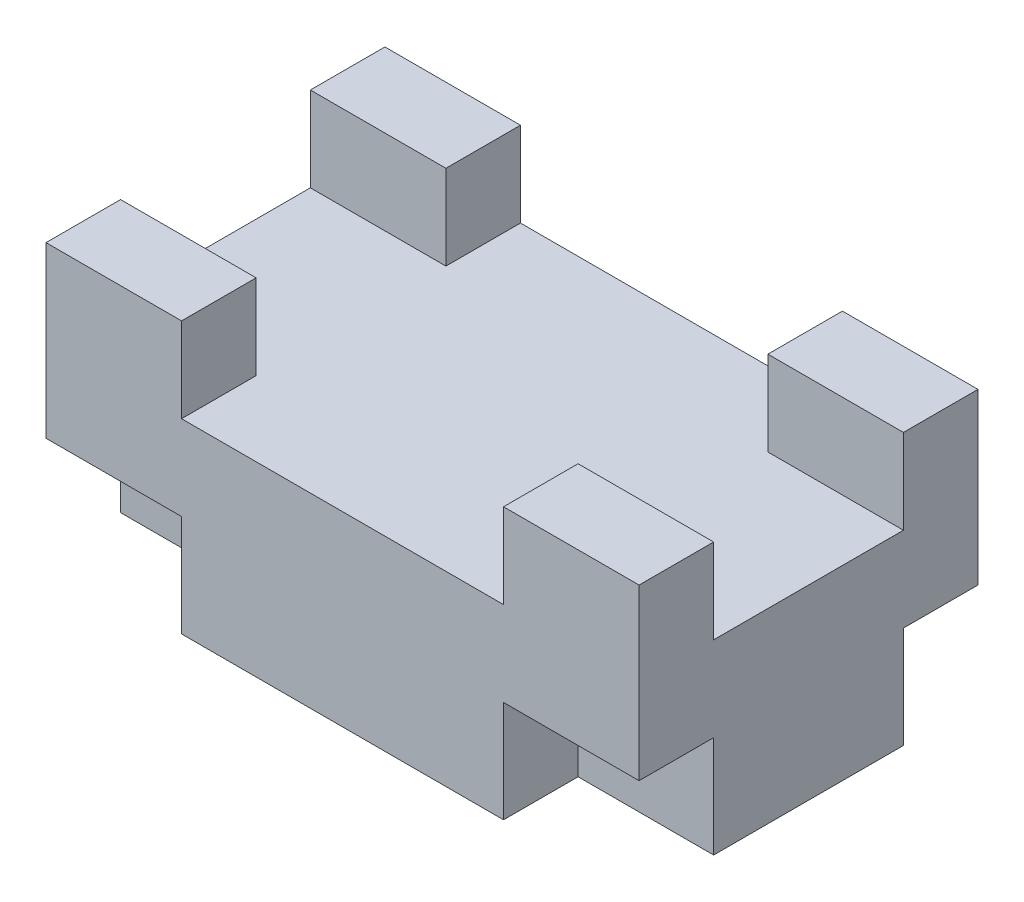
ISO-10303-21;
HEADER;
FILE_DESCRIPTION(('STEP AP214'),'2;1');
FILE_NAME('part.step','',(''),(''),'','','');
FILE_SCHEMA(('AUTOMOTIVE_DESIGN { 1 0 10303 214 1 1 1 1 }'));
ENDSEC;
DATA;
#1=APPLICATION_CONTEXT('core data for automotive mechanical design processes');
#2=APPLICATION_PROTOCOL_DEFINITION('international standard','automotive_design',2000,#1);
#3=PRODUCT_CONTEXT('',#1,'mechanical');
#4=PRODUCT('Part','Part','',(#3));
#5=PRODUCT_RELATED_PRODUCT_CATEGORY('part','',(#4));
#6=PRODUCT_DEFINITION_FORMATION('','',#4);
#7=PRODUCT_DEFINITION_CONTEXT('part definition',#1,'design');
#8=PRODUCT_DEFINITION('design','',#6,#7);
#9=PRODUCT_DEFINITION_SHAPE('','',#8);
#10=(LENGTH_UNIT() NAMED_UNIT(*) SI_UNIT(.MILLI.,.METRE.));
#11=(NAMED_UNIT(*) PLANE_ANGLE_UNIT() SI_UNIT($,.RADIAN.));
#12=(NAMED_UNIT(*) SI_UNIT($,.STERADIAN.) SOLID_ANGLE_UNIT());
#13=UNCERTAINTY_MEASURE_WITH_UNIT(LENGTH_MEASURE(1.E-05),#10,'distance_accuracy_value','');
#14=(GEOMETRIC_REPRESENTATION_CONTEXT(3) GLOBAL_UNCERTAINTY_ASSIGNED_CONTEXT((#13)) GLOBAL_UNIT_ASSIGNED_CONTEXT((#10,
#11,#12)) REPRESENTATION_CONTEXT('',''));
#15=CARTESIAN_POINT('',(0.,0.,0.));
#16=DIRECTION('',(0.,0.,1.));
#17=DIRECTION('',(1.,0.,0.));
#18=AXIS2_PLACEMENT_3D('',#15,#16,#17);
#19=CARTESIAN_POINT('',(0.,30.,0.));
#20=DIRECTION('',(0.,0.,1.));
#21=DIRECTION('',(1.,0.,0.));
#22=AXIS2_PLACEMENT_3D('',#19,#20,#21);
#23=PLANE('',#22);
#24=DIRECTION('',(1.,0.,0.));
#25=VECTOR('',#24,1.);
#26=CARTESIAN_POINT('',(0.,30.,0.));
#27=LINE('',#26,#25);
#28=CARTESIAN_POINT('',(-175.,30.,0.));
#29=VERTEX_POINT('',#28);
#30=CARTESIAN_POINT('',(-135.,30.,0.));
#31=VERTEX_POINT('',#30);
#32=EDGE_CURVE('E340',#29,#31,#27,.T.);
#33=ORIENTED_EDGE('',*,*,#32,.T.);
#34=DIRECTION('',(0.,-1.,0.));
#35=VECTOR('',#34,1.);
#36=CARTESIAN_POINT('',(-135.,30.,0.));
#37=LINE('',#36,#35);
#38=CARTESIAN_POINT('',(-135.,0.,0.));
#39=VERTEX_POINT('',#38);
#40=EDGE_CURVE('E373',#31,#39,#37,.T.);
#41=ORIENTED_EDGE('',*,*,#40,.T.);
#42=DIRECTION('',(-1.,0.,0.));
#43=VECTOR('',#42,1.);
#44=CARTESIAN_POINT('',(0.,0.,0.));
#45=LINE('',#44,#43);
#46=CARTESIAN_POINT('',(-40.,0.,0.));
#47=VERTEX_POINT('',#46);
#48=EDGE_CURVE('E352',#47,#39,#45,.T.);
#49=ORIENTED_EDGE('',*,*,#48,.F.);
#50=DIRECTION('',(0.,-1.,0.));
#51=VECTOR('',#50,1.);
#52=CARTESIAN_POINT('',(-40.,30.,0.));
#53=LINE('',#52,#51);
#54=CARTESIAN_POINT('',(-40.,30.,0.));
#55=VERTEX_POINT('',#54);
#56=EDGE_CURVE('E427',#55,#47,#53,.T.);
#57=ORIENTED_EDGE('',*,*,#56,.F.);
#58=CARTESIAN_POINT('',(0.,30.,0.));
#59=VERTEX_POINT('',#58);
#60=EDGE_CURVE('E337',#55,#59,#27,.T.);
#61=ORIENTED_EDGE('',*,*,#60,.T.);
#62=DIRECTION('',(0.,-1.,0.));
#63=VECTOR('',#62,1.);
#64=CARTESIAN_POINT('',(0.,55.,0.));
#65=LINE('',#64,#63);
#66=CARTESIAN_POINT('',(0.,80.,0.));
#67=VERTEX_POINT('',#66);
#68=EDGE_CURVE('E231',#67,#59,#65,.T.);
#69=ORIENTED_EDGE('',*,*,#68,.F.);
#70=DIRECTION('',(1.,0.,0.));
#71=VECTOR('',#70,1.);
#72=CARTESIAN_POINT('',(0.,80.,0.));
#73=LINE('',#72,#71);
#74=CARTESIAN_POINT('',(-40.,80.,0.));
#75=VERTEX_POINT('',#74);
#76=EDGE_CURVE('E272',#75,#67,#73,.T.);
#77=ORIENTED_EDGE('',*,*,#76,.F.);
#78=DIRECTION('',(0.,-1.,0.));
#79=VECTOR('',#78,1.);
#80=CARTESIAN_POINT('',(-40.,80.,0.));
#81=LINE('',#80,#79);
#82=CARTESIAN_POINT('',(-40.,55.,0.));
#83=VERTEX_POINT('',#82);
#84=EDGE_CURVE('E277',#75,#83,#81,.T.);
#85=ORIENTED_EDGE('',*,*,#84,.T.);
#86=DIRECTION('',(1.,0.,0.));
#87=VECTOR('',#86,1.);
#88=CARTESIAN_POINT('',(0.,55.,0.));
#89=LINE('',#88,#87);
#90=CARTESIAN_POINT('',(-135.,55.,0.));
#91=VERTEX_POINT('',#90);
#92=EDGE_CURVE('E330',#91,#83,#89,.T.);
#93=ORIENTED_EDGE('',*,*,#92,.F.);
#94=DIRECTION('',(0.,-1.,0.));
#95=VECTOR('',#94,1.);
#96=CARTESIAN_POINT('',(-135.,80.,0.));
#97=LINE('',#96,#95);
#98=CARTESIAN_POINT('',(-135.,80.,0.));
#99=VERTEX_POINT('',#98);
#100=EDGE_CURVE('E270',#99,#91,#97,.T.);
#101=ORIENTED_EDGE('',*,*,#100,.F.);
#102=DIRECTION('',(1.,0.,0.));
#103=VECTOR('',#102,1.);
#104=CARTESIAN_POINT('',(0.,80.,0.));
#105=LINE('',#104,#103);
#106=CARTESIAN_POINT('',(-175.,80.,0.));
#107=VERTEX_POINT('',#106);
#108=EDGE_CURVE('E290',#107,#99,#105,.T.);
#109=ORIENTED_EDGE('',*,*,#108,.F.);
#110=DIRECTION('',(0.,-1.,0.));
#111=VECTOR('',#110,1.);
#112=CARTESIAN_POINT('',(-175.,55.,0.));
#113=LINE('',#112,#111);
#114=EDGE_CURVE('E349',#107,#29,#113,.T.);
#115=ORIENTED_EDGE('',*,*,#114,.T.);
#116=EDGE_LOOP('',(#33,#41,#49,#57,#61,#69,#77,#85,#93,#101,#109,#115));
#117=FACE_BOUND('',#116,.T.);
#118=ADVANCED_FACE('F41',(#117),#23,.T.);
#119=CARTESIAN_POINT('',(-40.,30.,0.));
#120=DIRECTION('',(-1.,0.,0.));
#121=DIRECTION('',(0.,0.,1.));
#122=AXIS2_PLACEMENT_3D('',#119,#120,#121);
#123=PLANE('',#122);
#124=DIRECTION('',(0.,0.,-1.));
#125=VECTOR('',#124,1.);
#126=CARTESIAN_POINT('',(-40.,0.,0.));
#127=LINE('',#126,#125);
#128=CARTESIAN_POINT('',(-40.,0.,-22.0000000000001));
#129=VERTEX_POINT('',#128);
#130=EDGE_CURVE('E376',#47,#129,#127,.T.);
#131=ORIENTED_EDGE('',*,*,#130,.T.);
#132=DIRECTION('',(0.,-1.,0.));
#133=VECTOR('',#132,1.);
#134=CARTESIAN_POINT('',(-40.,30.,-22.0000000000001));
#135=LINE('',#134,#133);
#136=CARTESIAN_POINT('',(-40.,30.,-22.0000000000001));
#137=VERTEX_POINT('',#136);
#138=EDGE_CURVE('E430',#137,#129,#135,.T.);
#139=ORIENTED_EDGE('',*,*,#138,.F.);
#140=DIRECTION('',(0.,0.,-1.));
#141=VECTOR('',#140,1.);
#142=CARTESIAN_POINT('',(-40.,30.,0.));
#143=LINE('',#142,#141);
#144=EDGE_CURVE('E355',#55,#137,#143,.T.);
#145=ORIENTED_EDGE('',*,*,#144,.F.);
#146=ORIENTED_EDGE('',*,*,#56,.T.);
#147=EDGE_LOOP('',(#131,#139,#145,#146));
#148=FACE_BOUND('',#147,.T.);
#149=ADVANCED_FACE('F496',(#148),#123,.F.);
#150=CARTESIAN_POINT('',(0.,30.,-22.));
#151=DIRECTION('',(0.,0.,1.));
#152=DIRECTION('',(1.,0.,0.));
#153=AXIS2_PLACEMENT_3D('',#150,#151,#152);
#154=PLANE('',#153);
#155=DIRECTION('',(-1.,0.,0.));
#156=VECTOR('',#155,1.);
#157=CARTESIAN_POINT('',(0.,0.,-22.));
#158=LINE('',#157,#156);
#159=CARTESIAN_POINT('',(0.,0.,-22.));
#160=VERTEX_POINT('',#159);
#161=EDGE_CURVE('E377',#160,#129,#158,.T.);
#162=ORIENTED_EDGE('',*,*,#161,.F.);
#163=DIRECTION('',(0.,-1.,0.));
#164=VECTOR('',#163,1.);
#165=CARTESIAN_POINT('',(0.,30.,-22.));
#166=LINE('',#165,#164);
#167=CARTESIAN_POINT('',(0.,30.,-22.0000000000001));
#168=VERTEX_POINT('',#167);
#169=EDGE_CURVE('E422',#168,#160,#166,.T.);
#170=ORIENTED_EDGE('',*,*,#169,.F.);
#171=DIRECTION('',(-1.,0.,0.));
#172=VECTOR('',#171,1.);
#173=CARTESIAN_POINT('',(0.,30.,-22.));
#174=LINE('',#173,#172);
#175=EDGE_CURVE('E351',#168,#137,#174,.T.);
#176=ORIENTED_EDGE('',*,*,#175,.T.);
#177=ORIENTED_EDGE('',*,*,#138,.T.);
#178=EDGE_LOOP('',(#162,#170,#176,#177));
#179=FACE_BOUND('',#178,.T.);
#180=ADVANCED_FACE('F503',(#179),#154,.T.);
#181=CARTESIAN_POINT('',(0.,30.,0.));
#182=DIRECTION('',(-1.,0.,0.));
#183=DIRECTION('',(0.,0.,1.));
#184=AXIS2_PLACEMENT_3D('',#181,#182,#183);
#185=PLANE('',#184);
#186=DIRECTION('',(0.,-1.,0.));
#187=VECTOR('',#186,1.);
#188=CARTESIAN_POINT('',(0.,55.,-100.));
#189=LINE('',#188,#187);
#190=CARTESIAN_POINT('',(0.,80.,-100.));
#191=VERTEX_POINT('',#190);
#192=CARTESIAN_POINT('',(0.,30.,-100.));
#193=VERTEX_POINT('',#192);
#194=EDGE_CURVE('E225',#191,#193,#189,.T.);
#195=ORIENTED_EDGE('',*,*,#194,.F.);
#196=DIRECTION('',(0.,0.,1.));
#197=VECTOR('',#196,1.);
#198=CARTESIAN_POINT('',(0.,80.,0.));
#199=LINE('',#198,#197);
#200=CARTESIAN_POINT('',(0.,80.,-78.));
#201=VERTEX_POINT('',#200);
#202=EDGE_CURVE('E227',#191,#201,#199,.T.);
#203=ORIENTED_EDGE('',*,*,#202,.T.);
#204=DIRECTION('',(0.,-1.,0.));
#205=VECTOR('',#204,1.);
#206=CARTESIAN_POINT('',(0.,80.,-78.));
#207=LINE('',#206,#205);
#208=CARTESIAN_POINT('',(0.,55.,-78.));
#209=VERTEX_POINT('',#208);
#210=EDGE_CURVE('E258',#201,#209,#207,.T.);
#211=ORIENTED_EDGE('',*,*,#210,.T.);
#212=DIRECTION('',(0.,0.,-1.));
#213=VECTOR('',#212,1.);
#214=CARTESIAN_POINT('',(0.,55.,0.));
#215=LINE('',#214,#213);
#216=CARTESIAN_POINT('',(0.,55.,-22.));
#217=VERTEX_POINT('',#216);
#218=EDGE_CURVE('E329',#217,#209,#215,.T.);
#219=ORIENTED_EDGE('',*,*,#218,.F.);
#220=DIRECTION('',(0.,-1.,0.));
#221=VECTOR('',#220,1.);
#222=CARTESIAN_POINT('',(0.,80.,-22.));
#223=LINE('',#222,#221);
#224=CARTESIAN_POINT('',(0.,80.,-22.));
#225=VERTEX_POINT('',#224);
#226=EDGE_CURVE('E243',#225,#217,#223,.T.);
#227=ORIENTED_EDGE('',*,*,#226,.F.);
#228=DIRECTION('',(0.,0.,1.));
#229=VECTOR('',#228,1.);
#230=CARTESIAN_POINT('',(0.,80.,0.));
#231=LINE('',#230,#229);
#232=EDGE_CURVE('E263',#225,#67,#231,.T.);
#233=ORIENTED_EDGE('',*,*,#232,.T.);
#234=ORIENTED_EDGE('',*,*,#68,.T.);
#235=DIRECTION('',(0.,0.,-1.));
#236=VECTOR('',#235,1.);
#237=CARTESIAN_POINT('',(0.,30.,0.));
#238=LINE('',#237,#236);
#239=EDGE_CURVE('E338',#59,#168,#238,.T.);
#240=ORIENTED_EDGE('',*,*,#239,.T.);
#241=ORIENTED_EDGE('',*,*,#169,.T.);
#242=DIRECTION('',(0.,0.,-1.));
#243=VECTOR('',#242,1.);
#244=CARTESIAN_POINT('',(0.,0.,0.));
#245=LINE('',#244,#243);
#246=CARTESIAN_POINT('',(0.,0.,-78.));
#247=VERTEX_POINT('',#246);
#248=EDGE_CURVE('E385',#160,#247,#245,.T.);
#249=ORIENTED_EDGE('',*,*,#248,.T.);
#250=DIRECTION('',(0.,-1.,0.));
#251=VECTOR('',#250,1.);
#252=CARTESIAN_POINT('',(0.,30.,-78.));
#253=LINE('',#252,#251);
#254=CARTESIAN_POINT('',(0.,30.,-78.));
#255=VERTEX_POINT('',#254);
#256=EDGE_CURVE('E425',#255,#247,#253,.T.);
#257=ORIENTED_EDGE('',*,*,#256,.F.);
#258=EDGE_CURVE('E226',#255,#193,#238,.T.);
#259=ORIENTED_EDGE('',*,*,#258,.T.);
#260=EDGE_LOOP('',(#195,#203,#211,#219,#227,#233,#234,#240,#241,#249,#257,#259));
#261=FACE_BOUND('',#260,.T.);
#262=ADVANCED_FACE('F221',(#261),#185,.F.);
#263=CARTESIAN_POINT('',(0.,30.,-78.));
#264=DIRECTION('',(0.,0.,1.));
#265=DIRECTION('',(1.,0.,0.));
#266=AXIS2_PLACEMENT_3D('',#263,#264,#265);
#267=PLANE('',#266);
#268=DIRECTION('',(-1.,0.,0.));
#269=VECTOR('',#268,1.);
#270=CARTESIAN_POINT('',(0.,0.,-78.));
#271=LINE('',#270,#269);
#272=CARTESIAN_POINT('',(-40.,0.,-78.));
#273=VERTEX_POINT('',#272);
#274=EDGE_CURVE('E383',#247,#273,#271,.T.);
#275=ORIENTED_EDGE('',*,*,#274,.T.);
#276=DIRECTION('',(0.,-1.,0.));
#277=VECTOR('',#276,1.);
#278=CARTESIAN_POINT('',(-40.,30.,-78.));
#279=LINE('',#278,#277);
#280=CARTESIAN_POINT('',(-40.,30.,-78.));
#281=VERTEX_POINT('',#280);
#282=EDGE_CURVE('E419',#281,#273,#279,.T.);
#283=ORIENTED_EDGE('',*,*,#282,.F.);
#284=DIRECTION('',(-1.,0.,0.));
#285=VECTOR('',#284,1.);
#286=CARTESIAN_POINT('',(0.,30.,-78.));
#287=LINE('',#286,#285);
#288=EDGE_CURVE('E359',#255,#281,#287,.T.);
#289=ORIENTED_EDGE('',*,*,#288,.F.);
#290=ORIENTED_EDGE('',*,*,#256,.T.);
#291=EDGE_LOOP('',(#275,#283,#289,#290));
#292=FACE_BOUND('',#291,.T.);
#293=ADVANCED_FACE('F513',(#292),#267,.F.);
#294=CARTESIAN_POINT('',(-40.,30.,0.));
#295=DIRECTION('',(1.,0.,0.));
#296=DIRECTION('',(0.,0.,-1.));
#297=AXIS2_PLACEMENT_3D('',#294,#295,#296);
#298=PLANE('',#297);
#299=DIRECTION('',(0.,0.,1.));
#300=VECTOR('',#299,1.);
#301=CARTESIAN_POINT('',(-40.,0.,0.));
#302=LINE('',#301,#300);
#303=CARTESIAN_POINT('',(-40.,0.,-100.));
#304=VERTEX_POINT('',#303);
#305=EDGE_CURVE('E390',#304,#273,#302,.T.);
#306=ORIENTED_EDGE('',*,*,#305,.F.);
#307=DIRECTION('',(0.,-1.,0.));
#308=VECTOR('',#307,1.);
#309=CARTESIAN_POINT('',(-40.,30.,-100.));
#310=LINE('',#309,#308);
#311=CARTESIAN_POINT('',(-40.,30.,-100.));
#312=VERTEX_POINT('',#311);
#313=EDGE_CURVE('E416',#312,#304,#310,.T.);
#314=ORIENTED_EDGE('',*,*,#313,.F.);
#315=DIRECTION('',(0.,0.,1.));
#316=VECTOR('',#315,1.);
#317=CARTESIAN_POINT('',(-40.,30.,0.));
#318=LINE('',#317,#316);
#319=EDGE_CURVE('E358',#312,#281,#318,.T.);
#320=ORIENTED_EDGE('',*,*,#319,.T.);
#321=ORIENTED_EDGE('',*,*,#282,.T.);
#322=EDGE_LOOP('',(#306,#314,#320,#321));
#323=FACE_BOUND('',#322,.T.);
#324=ADVANCED_FACE('F519',(#323),#298,.T.);
#325=CARTESIAN_POINT('',(0.,30.,-100.));
#326=DIRECTION('',(0.,0.,1.));
#327=DIRECTION('',(1.,0.,0.));
#328=AXIS2_PLACEMENT_3D('',#325,#326,#327);
#329=PLANE('',#328);
#330=DIRECTION('',(0.,-1.,0.));
#331=VECTOR('',#330,1.);
#332=CARTESIAN_POINT('',(-175.,55.,-100.));
#333=LINE('',#332,#331);
#334=CARTESIAN_POINT('',(-175.,80.,-100.));
#335=VERTEX_POINT('',#334);
#336=CARTESIAN_POINT('',(-175.,30.,-100.));
#337=VERTEX_POINT('',#336);
#338=EDGE_CURVE('E233',#335,#337,#333,.T.);
#339=ORIENTED_EDGE('',*,*,#338,.F.);
#340=DIRECTION('',(-1.,0.,0.));
#341=VECTOR('',#340,1.);
#342=CARTESIAN_POINT('',(0.,80.,-100.));
#343=LINE('',#342,#341);
#344=CARTESIAN_POINT('',(-135.,80.,-100.));
#345=VERTEX_POINT('',#344);
#346=EDGE_CURVE('E303',#345,#335,#343,.T.);
#347=ORIENTED_EDGE('',*,*,#346,.F.);
#348=DIRECTION('',(0.,-1.,0.));
#349=VECTOR('',#348,1.);
#350=CARTESIAN_POINT('',(-135.,80.,-100.));
#351=LINE('',#350,#349);
#352=CARTESIAN_POINT('',(-135.,55.,-100.));
#353=VERTEX_POINT('',#352);
#354=EDGE_CURVE('E319',#345,#353,#351,.T.);
#355=ORIENTED_EDGE('',*,*,#354,.T.);
#356=DIRECTION('',(-1.,0.,0.));
#357=VECTOR('',#356,1.);
#358=CARTESIAN_POINT('',(0.,55.,-100.));
#359=LINE('',#358,#357);
#360=CARTESIAN_POINT('',(-40.,55.,-100.));
#361=VERTEX_POINT('',#360);
#362=EDGE_CURVE('E335',#361,#353,#359,.T.);
#363=ORIENTED_EDGE('',*,*,#362,.F.);
#364=DIRECTION('',(0.,-1.,0.));
#365=VECTOR('',#364,1.);
#366=CARTESIAN_POINT('',(-40.,80.,-100.));
#367=LINE('',#366,#365);
#368=CARTESIAN_POINT('',(-40.,80.,-100.));
#369=VERTEX_POINT('',#368);
#370=EDGE_CURVE('E248',#369,#361,#367,.T.);
#371=ORIENTED_EDGE('',*,*,#370,.F.);
#372=DIRECTION('',(1.,0.,0.));
#373=VECTOR('',#372,1.);
#374=CARTESIAN_POINT('',(0.,80.,-100.));
#375=LINE('',#374,#373);
#376=EDGE_CURVE('E242',#369,#191,#375,.T.);
#377=ORIENTED_EDGE('',*,*,#376,.T.);
#378=ORIENTED_EDGE('',*,*,#194,.T.);
#379=DIRECTION('',(-1.,0.,0.));
#380=VECTOR('',#379,1.);
#381=CARTESIAN_POINT('',(0.,30.,-100.));
#382=LINE('',#381,#380);
#383=EDGE_CURVE('E327',#193,#312,#382,.T.);
#384=ORIENTED_EDGE('',*,*,#383,.T.);
#385=ORIENTED_EDGE('',*,*,#313,.T.);
#386=DIRECTION('',(-1.,0.,0.));
#387=VECTOR('',#386,1.);
#388=CARTESIAN_POINT('',(0.,0.,-100.));
#389=LINE('',#388,#387);
#390=CARTESIAN_POINT('',(-135.,0.,-100.));
#391=VERTEX_POINT('',#390);
#392=EDGE_CURVE('E388',#304,#391,#389,.T.);
#393=ORIENTED_EDGE('',*,*,#392,.T.);
#394=DIRECTION('',(0.,-1.,0.));
#395=VECTOR('',#394,1.);
#396=CARTESIAN_POINT('',(-135.,30.,-100.));
#397=LINE('',#396,#395);
#398=CARTESIAN_POINT('',(-135.,30.,-100.));
#399=VERTEX_POINT('',#398);
#400=EDGE_CURVE('E413',#399,#391,#397,.T.);
#401=ORIENTED_EDGE('',*,*,#400,.F.);
#402=EDGE_CURVE('E344',#399,#337,#382,.T.);
#403=ORIENTED_EDGE('',*,*,#402,.T.);
#404=EDGE_LOOP('',(#339,#347,#355,#363,#371,#377,#378,#384,#385,#393,#401,#403));
#405=FACE_BOUND('',#404,.T.);
#406=ADVANCED_FACE('F250',(#405),#329,.F.);
#407=CARTESIAN_POINT('',(-135.,30.,0.));
#408=DIRECTION('',(1.,0.,0.));
#409=DIRECTION('',(0.,0.,-1.));
#410=AXIS2_PLACEMENT_3D('',#407,#408,#409);
#411=PLANE('',#410);
#412=DIRECTION('',(0.,0.,1.));
#413=VECTOR('',#412,1.);
#414=CARTESIAN_POINT('',(-135.,0.,0.));
#415=LINE('',#414,#413);
#416=CARTESIAN_POINT('',(-135.,0.,-78.));
#417=VERTEX_POINT('',#416);
#418=EDGE_CURVE('E395',#391,#417,#415,.T.);
#419=ORIENTED_EDGE('',*,*,#418,.T.);
#420=DIRECTION('',(0.,-1.,0.));
#421=VECTOR('',#420,1.);
#422=CARTESIAN_POINT('',(-135.,30.,-78.));
#423=LINE('',#422,#421);
#424=CARTESIAN_POINT('',(-135.,30.,-78.));
#425=VERTEX_POINT('',#424);
#426=EDGE_CURVE('E414',#425,#417,#423,.T.);
#427=ORIENTED_EDGE('',*,*,#426,.F.);
#428=DIRECTION('',(0.,0.,1.));
#429=VECTOR('',#428,1.);
#430=CARTESIAN_POINT('',(-135.,30.,0.));
#431=LINE('',#430,#429);
#432=EDGE_CURVE('E361',#399,#425,#431,.T.);
#433=ORIENTED_EDGE('',*,*,#432,.F.);
#434=ORIENTED_EDGE('',*,*,#400,.T.);
#435=EDGE_LOOP('',(#419,#427,#433,#434));
#436=FACE_BOUND('',#435,.T.);
#437=ADVANCED_FACE('F523',(#436),#411,.F.);
#438=CARTESIAN_POINT('',(0.,30.,-78.));
#439=DIRECTION('',(0.,0.,-1.));
#440=DIRECTION('',(-1.,0.,0.));
#441=AXIS2_PLACEMENT_3D('',#438,#439,#440);
#442=PLANE('',#441);
#443=DIRECTION('',(1.,0.,0.));
#444=VECTOR('',#443,1.);
#445=CARTESIAN_POINT('',(0.,0.,-78.));
#446=LINE('',#445,#444);
#447=CARTESIAN_POINT('',(-175.,0.,-78.));
#448=VERTEX_POINT('',#447);
#449=EDGE_CURVE('E393',#448,#417,#446,.T.);
#450=ORIENTED_EDGE('',*,*,#449,.F.);
#451=DIRECTION('',(0.,-1.,0.));
#452=VECTOR('',#451,1.);
#453=CARTESIAN_POINT('',(-175.,30.,-78.));
#454=LINE('',#453,#452);
#455=CARTESIAN_POINT('',(-175.,30.,-78.));
#456=VERTEX_POINT('',#455);
#457=EDGE_CURVE('E412',#456,#448,#454,.T.);
#458=ORIENTED_EDGE('',*,*,#457,.F.);
#459=DIRECTION('',(1.,0.,0.));
#460=VECTOR('',#459,1.);
#461=CARTESIAN_POINT('',(0.,30.,-78.));
#462=LINE('',#461,#460);
#463=EDGE_CURVE('E364',#456,#425,#462,.T.);
#464=ORIENTED_EDGE('',*,*,#463,.T.);
#465=ORIENTED_EDGE('',*,*,#426,.T.);
#466=EDGE_LOOP('',(#450,#458,#464,#465));
#467=FACE_BOUND('',#466,.T.);
#468=ADVANCED_FACE('F526',(#467),#442,.T.);
#469=CARTESIAN_POINT('',(-175.,30.,0.));
#470=DIRECTION('',(-1.,0.,0.));
#471=DIRECTION('',(0.,0.,1.));
#472=AXIS2_PLACEMENT_3D('',#469,#470,#471);
#473=PLANE('',#472);
#474=DIRECTION('',(0.,0.,-1.));
#475=VECTOR('',#474,1.);
#476=CARTESIAN_POINT('',(-175.,30.,0.));
#477=LINE('',#476,#475);
#478=EDGE_CURVE('E323',#456,#337,#477,.T.);
#479=ORIENTED_EDGE('',*,*,#478,.F.);
#480=ORIENTED_EDGE('',*,*,#457,.T.);
#481=DIRECTION('',(0.,0.,-1.));
#482=VECTOR('',#481,1.);
#483=CARTESIAN_POINT('',(-175.,0.,0.));
#484=LINE('',#483,#482);
#485=CARTESIAN_POINT('',(-175.,0.,-22.));
#486=VERTEX_POINT('',#485);
#487=EDGE_CURVE('E399',#486,#448,#484,.T.);
#488=ORIENTED_EDGE('',*,*,#487,.F.);
#489=DIRECTION('',(0.,-1.,0.));
#490=VECTOR('',#489,1.);
#491=CARTESIAN_POINT('',(-175.,30.,-22.));
#492=LINE('',#491,#490);
#493=CARTESIAN_POINT('',(-175.,30.,-22.));
#494=VERTEX_POINT('',#493);
#495=EDGE_CURVE('E406',#494,#486,#492,.T.);
#496=ORIENTED_EDGE('',*,*,#495,.F.);
#497=EDGE_CURVE('E331',#29,#494,#477,.T.);
#498=ORIENTED_EDGE('',*,*,#497,.F.);
#499=ORIENTED_EDGE('',*,*,#114,.F.);
#500=DIRECTION('',(0.,0.,1.));
#501=VECTOR('',#500,1.);
#502=CARTESIAN_POINT('',(-175.,80.,0.));
#503=LINE('',#502,#501);
#504=CARTESIAN_POINT('',(-175.,80.,-22.));
#505=VERTEX_POINT('',#504);
#506=EDGE_CURVE('E281',#505,#107,#503,.T.);
#507=ORIENTED_EDGE('',*,*,#506,.F.);
#508=DIRECTION('',(0.,-1.,0.));
#509=VECTOR('',#508,1.);
#510=CARTESIAN_POINT('',(-175.,80.,-22.));
#511=LINE('',#510,#509);
#512=CARTESIAN_POINT('',(-175.,55.,-22.));
#513=VERTEX_POINT('',#512);
#514=EDGE_CURVE('E293',#505,#513,#511,.T.);
#515=ORIENTED_EDGE('',*,*,#514,.T.);
#516=DIRECTION('',(0.,0.,-1.));
#517=VECTOR('',#516,1.);
#518=CARTESIAN_POINT('',(-175.,55.,0.));
#519=LINE('',#518,#517);
#520=CARTESIAN_POINT('',(-175.,55.,-78.));
#521=VERTEX_POINT('',#520);
#522=EDGE_CURVE('E322',#513,#521,#519,.T.);
#523=ORIENTED_EDGE('',*,*,#522,.T.);
#524=DIRECTION('',(0.,-1.,0.));
#525=VECTOR('',#524,1.);
#526=CARTESIAN_POINT('',(-175.,80.,-78.));
#527=LINE('',#526,#525);
#528=CARTESIAN_POINT('',(-175.,80.,-78.));
#529=VERTEX_POINT('',#528);
#530=EDGE_CURVE('E320',#529,#521,#527,.T.);
#531=ORIENTED_EDGE('',*,*,#530,.F.);
#532=DIRECTION('',(0.,0.,-1.));
#533=VECTOR('',#532,1.);
#534=CARTESIAN_POINT('',(-175.,80.,0.));
#535=LINE('',#534,#533);
#536=EDGE_CURVE('E306',#529,#335,#535,.T.);
#537=ORIENTED_EDGE('',*,*,#536,.T.);
#538=ORIENTED_EDGE('',*,*,#338,.T.);
#539=EDGE_LOOP('',(#479,#480,#488,#496,#498,#499,#507,#515,#523,#531,#537,#538));
#540=FACE_BOUND('',#539,.T.);
#541=ADVANCED_FACE('F448',(#540),#473,.T.);
#542=CARTESIAN_POINT('',(0.,30.,-22.));
#543=DIRECTION('',(0.,0.,-1.));
#544=DIRECTION('',(-1.,0.,0.));
#545=AXIS2_PLACEMENT_3D('',#542,#543,#544);
#546=PLANE('',#545);
#547=DIRECTION('',(1.,0.,0.));
#548=VECTOR('',#547,1.);
#549=CARTESIAN_POINT('',(0.,0.,-22.));
#550=LINE('',#549,#548);
#551=CARTESIAN_POINT('',(-135.,0.,-22.));
#552=VERTEX_POINT('',#551);
#553=EDGE_CURVE('E402',#486,#552,#550,.T.);
#554=ORIENTED_EDGE('',*,*,#553,.T.);
#555=DIRECTION('',(0.,-1.,0.));
#556=VECTOR('',#555,1.);
#557=CARTESIAN_POINT('',(-135.,30.,-22.));
#558=LINE('',#557,#556);
#559=CARTESIAN_POINT('',(-135.,30.,-22.));
#560=VERTEX_POINT('',#559);
#561=EDGE_CURVE('E410',#560,#552,#558,.T.);
#562=ORIENTED_EDGE('',*,*,#561,.F.);
#563=DIRECTION('',(1.,0.,0.));
#564=VECTOR('',#563,1.);
#565=CARTESIAN_POINT('',(0.,30.,-22.));
#566=LINE('',#565,#564);
#567=EDGE_CURVE('E366',#494,#560,#566,.T.);
#568=ORIENTED_EDGE('',*,*,#567,.F.);
#569=ORIENTED_EDGE('',*,*,#495,.T.);
#570=EDGE_LOOP('',(#554,#562,#568,#569));
#571=FACE_BOUND('',#570,.T.);
#572=ADVANCED_FACE('F532',(#571),#546,.F.);
#573=CARTESIAN_POINT('',(-135.,30.,0.));
#574=DIRECTION('',(-1.,0.,0.));
#575=DIRECTION('',(0.,0.,1.));
#576=AXIS2_PLACEMENT_3D('',#573,#574,#575);
#577=PLANE('',#576);
#578=DIRECTION('',(0.,0.,-1.));
#579=VECTOR('',#578,1.);
#580=CARTESIAN_POINT('',(-135.,0.,0.));
#581=LINE('',#580,#579);
#582=EDGE_CURVE('E353',#39,#552,#581,.T.);
#583=ORIENTED_EDGE('',*,*,#582,.F.);
#584=ORIENTED_EDGE('',*,*,#40,.F.);
#585=DIRECTION('',(0.,0.,-1.));
#586=VECTOR('',#585,1.);
#587=CARTESIAN_POINT('',(-135.,30.,0.));
#588=LINE('',#587,#586);
#589=EDGE_CURVE('E367',#31,#560,#588,.T.);
#590=ORIENTED_EDGE('',*,*,#589,.T.);
#591=ORIENTED_EDGE('',*,*,#561,.T.);
#592=EDGE_LOOP('',(#583,#584,#590,#591));
#593=FACE_BOUND('',#592,.T.);
#594=ADVANCED_FACE('F538',(#593),#577,.T.);
#595=CARTESIAN_POINT('',(0.,0.,0.));
#596=DIRECTION('',(0.,1.,0.));
#597=DIRECTION('',(0.,0.,1.));
#598=AXIS2_PLACEMENT_3D('',#595,#596,#597);
#599=PLANE('',#598);
#600=ORIENTED_EDGE('',*,*,#48,.T.);
#601=ORIENTED_EDGE('',*,*,#582,.T.);
#602=ORIENTED_EDGE('',*,*,#553,.F.);
#603=ORIENTED_EDGE('',*,*,#487,.T.);
#604=ORIENTED_EDGE('',*,*,#449,.T.);
#605=ORIENTED_EDGE('',*,*,#418,.F.);
#606=ORIENTED_EDGE('',*,*,#392,.F.);
#607=ORIENTED_EDGE('',*,*,#305,.T.);
#608=ORIENTED_EDGE('',*,*,#274,.F.);
#609=ORIENTED_EDGE('',*,*,#248,.F.);
#610=ORIENTED_EDGE('',*,*,#161,.T.);
#611=ORIENTED_EDGE('',*,*,#130,.F.);
#612=EDGE_LOOP('',(#600,#601,#602,#603,#604,#605,#606,#607,#608,#609,#610,#611));
#613=FACE_BOUND('',#612,.T.);
#614=ADVANCED_FACE('F545',(#613),#599,.F.);
#615=CARTESIAN_POINT('',(0.,30.,0.));
#616=DIRECTION('',(0.,1.,0.));
#617=DIRECTION('',(0.,0.,1.));
#618=AXIS2_PLACEMENT_3D('',#615,#616,#617);
#619=PLANE('',#618);
#620=ORIENTED_EDGE('',*,*,#60,.F.);
#621=ORIENTED_EDGE('',*,*,#144,.T.);
#622=ORIENTED_EDGE('',*,*,#175,.F.);
#623=ORIENTED_EDGE('',*,*,#239,.F.);
#624=EDGE_LOOP('',(#620,#621,#622,#623));
#625=FACE_BOUND('',#624,.T.);
#626=ADVANCED_FACE('F544',(#625),#619,.F.);
#627=ORIENTED_EDGE('',*,*,#258,.F.);
#628=ORIENTED_EDGE('',*,*,#288,.T.);
#629=ORIENTED_EDGE('',*,*,#319,.F.);
#630=ORIENTED_EDGE('',*,*,#383,.F.);
#631=EDGE_LOOP('',(#627,#628,#629,#630));
#632=FACE_BOUND('',#631,.T.);
#633=ADVANCED_FACE('F548',(#632),#619,.F.);
#634=ORIENTED_EDGE('',*,*,#402,.F.);
#635=ORIENTED_EDGE('',*,*,#432,.T.);
#636=ORIENTED_EDGE('',*,*,#463,.F.);
#637=ORIENTED_EDGE('',*,*,#478,.T.);
#638=EDGE_LOOP('',(#634,#635,#636,#637));
#639=FACE_BOUND('',#638,.T.);
#640=ADVANCED_FACE('F676',(#639),#619,.F.);
#641=ORIENTED_EDGE('',*,*,#497,.T.);
#642=ORIENTED_EDGE('',*,*,#567,.T.);
#643=ORIENTED_EDGE('',*,*,#589,.F.);
#644=ORIENTED_EDGE('',*,*,#32,.F.);
#645=EDGE_LOOP('',(#641,#642,#643,#644));
#646=FACE_BOUND('',#645,.T.);
#647=ADVANCED_FACE('F552',(#646),#619,.F.);
#648=CARTESIAN_POINT('',(0.,55.,0.));
#649=DIRECTION('',(0.,1.,0.));
#650=DIRECTION('',(0.,0.,1.));
#651=AXIS2_PLACEMENT_3D('',#648,#649,#650);
#652=PLANE('',#651);
#653=DIRECTION('',(0.,0.,-1.));
#654=VECTOR('',#653,1.);
#655=CARTESIAN_POINT('',(-135.,55.,0.));
#656=LINE('',#655,#654);
#657=CARTESIAN_POINT('',(-135.,55.,-22.));
#658=VERTEX_POINT('',#657);
#659=EDGE_CURVE('E11',#91,#658,#656,.T.);
#660=ORIENTED_EDGE('',*,*,#659,.F.);
#661=ORIENTED_EDGE('',*,*,#92,.T.);
#662=DIRECTION('',(0.,0.,1.));
#663=VECTOR('',#662,1.);
#664=CARTESIAN_POINT('',(-40.,55.,0.));
#665=LINE('',#664,#663);
#666=CARTESIAN_POINT('',(-40.,55.,-22.0000000000001));
#667=VERTEX_POINT('',#666);
#668=EDGE_CURVE('E58',#667,#83,#665,.T.);
#669=ORIENTED_EDGE('',*,*,#668,.F.);
#670=DIRECTION('',(-1.,0.,0.));
#671=VECTOR('',#670,1.);
#672=CARTESIAN_POINT('',(0.,55.,-22.));
#673=LINE('',#672,#671);
#674=EDGE_CURVE('E441',#217,#667,#673,.T.);
#675=ORIENTED_EDGE('',*,*,#674,.F.);
#676=ORIENTED_EDGE('',*,*,#218,.T.);
#677=DIRECTION('',(1.,0.,0.));
#678=VECTOR('',#677,1.);
#679=CARTESIAN_POINT('',(0.,55.,-78.));
#680=LINE('',#679,#678);
#681=CARTESIAN_POINT('',(-40.,55.,-78.));
#682=VERTEX_POINT('',#681);
#683=EDGE_CURVE('E440',#682,#209,#680,.T.);
#684=ORIENTED_EDGE('',*,*,#683,.F.);
#685=DIRECTION('',(0.,0.,1.));
#686=VECTOR('',#685,1.);
#687=CARTESIAN_POINT('',(-40.,55.,0.));
#688=LINE('',#687,#686);
#689=EDGE_CURVE('E439',#361,#682,#688,.T.);
#690=ORIENTED_EDGE('',*,*,#689,.F.);
#691=ORIENTED_EDGE('',*,*,#362,.T.);
#692=DIRECTION('',(0.,0.,-1.));
#693=VECTOR('',#692,1.);
#694=CARTESIAN_POINT('',(-135.,55.,0.));
#695=LINE('',#694,#693);
#696=CARTESIAN_POINT('',(-135.,55.,-78.));
#697=VERTEX_POINT('',#696);
#698=EDGE_CURVE('E432',#697,#353,#695,.T.);
#699=ORIENTED_EDGE('',*,*,#698,.F.);
#700=DIRECTION('',(1.,0.,0.));
#701=VECTOR('',#700,1.);
#702=CARTESIAN_POINT('',(0.,55.,-78.));
#703=LINE('',#702,#701);
#704=EDGE_CURVE('E431',#521,#697,#703,.T.);
#705=ORIENTED_EDGE('',*,*,#704,.F.);
#706=ORIENTED_EDGE('',*,*,#522,.F.);
#707=DIRECTION('',(-1.,0.,0.));
#708=VECTOR('',#707,1.);
#709=CARTESIAN_POINT('',(0.,55.,-22.));
#710=LINE('',#709,#708);
#711=EDGE_CURVE('E48',#658,#513,#710,.T.);
#712=ORIENTED_EDGE('',*,*,#711,.F.);
#713=EDGE_LOOP('',(#660,#661,#669,#675,#676,#684,#690,#691,#699,#705,#706,#712));
#714=FACE_BOUND('',#713,.T.);
#715=ADVANCED_FACE('F462',(#714),#652,.T.);
#716=CARTESIAN_POINT('',(-135.,80.,0.));
#717=DIRECTION('',(1.,0.,0.));
#718=DIRECTION('',(0.,0.,-1.));
#719=AXIS2_PLACEMENT_3D('',#716,#717,#718);
#720=PLANE('',#719);
#721=DIRECTION('',(0.,-1.,0.));
#722=VECTOR('',#721,1.);
#723=CARTESIAN_POINT('',(-135.,80.,-78.));
#724=LINE('',#723,#722);
#725=CARTESIAN_POINT('',(-135.,80.,-78.));
#726=VERTEX_POINT('',#725);
#727=EDGE_CURVE('E314',#726,#697,#724,.T.);
#728=ORIENTED_EDGE('',*,*,#727,.T.);
#729=ORIENTED_EDGE('',*,*,#698,.T.);
#730=ORIENTED_EDGE('',*,*,#354,.F.);
#731=DIRECTION('',(0.,0.,1.));
#732=VECTOR('',#731,1.);
#733=CARTESIAN_POINT('',(-135.,80.,0.));
#734=LINE('',#733,#732);
#735=EDGE_CURVE('E265',#345,#726,#734,.T.);
#736=ORIENTED_EDGE('',*,*,#735,.T.);
#737=EDGE_LOOP('',(#728,#729,#730,#736));
#738=FACE_BOUND('',#737,.T.);
#739=ADVANCED_FACE('F485',(#738),#720,.T.);
#740=CARTESIAN_POINT('',(0.,80.,-78.));
#741=DIRECTION('',(0.,0.,1.));
#742=DIRECTION('',(1.,0.,0.));
#743=AXIS2_PLACEMENT_3D('',#740,#741,#742);
#744=PLANE('',#743);
#745=ORIENTED_EDGE('',*,*,#530,.T.);
#746=ORIENTED_EDGE('',*,*,#704,.T.);
#747=ORIENTED_EDGE('',*,*,#727,.F.);
#748=DIRECTION('',(-1.,0.,0.));
#749=VECTOR('',#748,1.);
#750=CARTESIAN_POINT('',(0.,80.,-78.));
#751=LINE('',#750,#749);
#752=EDGE_CURVE('E313',#726,#529,#751,.T.);
#753=ORIENTED_EDGE('',*,*,#752,.T.);
#754=EDGE_LOOP('',(#745,#746,#747,#753));
#755=FACE_BOUND('',#754,.T.);
#756=ADVANCED_FACE('F484',(#755),#744,.T.);
#757=CARTESIAN_POINT('',(0.,80.,0.));
#758=DIRECTION('',(0.,1.,0.));
#759=DIRECTION('',(0.,0.,1.));
#760=AXIS2_PLACEMENT_3D('',#757,#758,#759);
#761=PLANE('',#760);
#762=ORIENTED_EDGE('',*,*,#735,.F.);
#763=ORIENTED_EDGE('',*,*,#346,.T.);
#764=ORIENTED_EDGE('',*,*,#536,.F.);
#765=ORIENTED_EDGE('',*,*,#752,.F.);
#766=EDGE_LOOP('',(#762,#763,#764,#765));
#767=FACE_BOUND('',#766,.T.);
#768=ADVANCED_FACE('F488',(#767),#761,.T.);
#769=CARTESIAN_POINT('',(-40.,80.,0.));
#770=DIRECTION('',(-1.,0.,0.));
#771=DIRECTION('',(0.,0.,1.));
#772=AXIS2_PLACEMENT_3D('',#769,#770,#771);
#773=PLANE('',#772);
#774=ORIENTED_EDGE('',*,*,#370,.T.);
#775=ORIENTED_EDGE('',*,*,#689,.T.);
#776=DIRECTION('',(0.,-1.,0.));
#777=VECTOR('',#776,1.);
#778=CARTESIAN_POINT('',(-40.,80.,-78.));
#779=LINE('',#778,#777);
#780=CARTESIAN_POINT('',(-40.,80.,-78.));
#781=VERTEX_POINT('',#780);
#782=EDGE_CURVE('E256',#781,#682,#779,.T.);
#783=ORIENTED_EDGE('',*,*,#782,.F.);
#784=DIRECTION('',(0.,0.,-1.));
#785=VECTOR('',#784,1.);
#786=CARTESIAN_POINT('',(-40.,80.,0.));
#787=LINE('',#786,#785);
#788=EDGE_CURVE('E253',#781,#369,#787,.T.);
#789=ORIENTED_EDGE('',*,*,#788,.T.);
#790=EDGE_LOOP('',(#774,#775,#783,#789));
#791=FACE_BOUND('',#790,.T.);
#792=ADVANCED_FACE('F476',(#791),#773,.T.);
#793=CARTESIAN_POINT('',(0.,80.,-78.));
#794=DIRECTION('',(0.,0.,1.));
#795=DIRECTION('',(1.,0.,0.));
#796=AXIS2_PLACEMENT_3D('',#793,#794,#795);
#797=PLANE('',#796);
#798=ORIENTED_EDGE('',*,*,#782,.T.);
#799=ORIENTED_EDGE('',*,*,#683,.T.);
#800=ORIENTED_EDGE('',*,*,#210,.F.);
#801=DIRECTION('',(-1.,0.,0.));
#802=VECTOR('',#801,1.);
#803=CARTESIAN_POINT('',(0.,80.,-78.));
#804=LINE('',#803,#802);
#805=EDGE_CURVE('E241',#201,#781,#804,.T.);
#806=ORIENTED_EDGE('',*,*,#805,.T.);
#807=EDGE_LOOP('',(#798,#799,#800,#806));
#808=FACE_BOUND('',#807,.T.);
#809=ADVANCED_FACE('F478',(#808),#797,.T.);
#810=CARTESIAN_POINT('',(0.,80.,0.));
#811=DIRECTION('',(0.,1.,0.));
#812=DIRECTION('',(0.,0.,1.));
#813=AXIS2_PLACEMENT_3D('',#810,#811,#812);
#814=PLANE('',#813);
#815=ORIENTED_EDGE('',*,*,#202,.F.);
#816=ORIENTED_EDGE('',*,*,#376,.F.);
#817=ORIENTED_EDGE('',*,*,#788,.F.);
#818=ORIENTED_EDGE('',*,*,#805,.F.);
#819=EDGE_LOOP('',(#815,#816,#817,#818));
#820=FACE_BOUND('',#819,.T.);
#821=ADVANCED_FACE('F239',(#820),#814,.T.);
#822=CARTESIAN_POINT('',(0.,80.,-22.));
#823=DIRECTION('',(0.,0.,-1.));
#824=DIRECTION('',(-1.,0.,0.));
#825=AXIS2_PLACEMENT_3D('',#822,#823,#824);
#826=PLANE('',#825);
#827=ORIENTED_EDGE('',*,*,#226,.T.);
#828=ORIENTED_EDGE('',*,*,#674,.T.);
#829=DIRECTION('',(0.,-1.,0.));
#830=VECTOR('',#829,1.);
#831=CARTESIAN_POINT('',(-40.,80.,-22.0000000000001));
#832=LINE('',#831,#830);
#833=CARTESIAN_POINT('',(-40.,80.,-22.0000000000001));
#834=VERTEX_POINT('',#833);
#835=EDGE_CURVE('E276',#834,#667,#832,.T.);
#836=ORIENTED_EDGE('',*,*,#835,.F.);
#837=DIRECTION('',(1.,0.,0.));
#838=VECTOR('',#837,1.);
#839=CARTESIAN_POINT('',(0.,80.,-22.));
#840=LINE('',#839,#838);
#841=EDGE_CURVE('E266',#834,#225,#840,.T.);
#842=ORIENTED_EDGE('',*,*,#841,.T.);
#843=EDGE_LOOP('',(#827,#828,#836,#842));
#844=FACE_BOUND('',#843,.T.);
#845=ADVANCED_FACE('F466',(#844),#826,.T.);
#846=CARTESIAN_POINT('',(-40.,80.,0.));
#847=DIRECTION('',(-1.,0.,0.));
#848=DIRECTION('',(0.,0.,1.));
#849=AXIS2_PLACEMENT_3D('',#846,#847,#848);
#850=PLANE('',#849);
#851=ORIENTED_EDGE('',*,*,#835,.T.);
#852=ORIENTED_EDGE('',*,*,#668,.T.);
#853=ORIENTED_EDGE('',*,*,#84,.F.);
#854=DIRECTION('',(0.,0.,-1.));
#855=VECTOR('',#854,1.);
#856=CARTESIAN_POINT('',(-40.,80.,0.));
#857=LINE('',#856,#855);
#858=EDGE_CURVE('E269',#75,#834,#857,.T.);
#859=ORIENTED_EDGE('',*,*,#858,.T.);
#860=EDGE_LOOP('',(#851,#852,#853,#859));
#861=FACE_BOUND('',#860,.T.);
#862=ADVANCED_FACE('F467',(#861),#850,.T.);
#863=CARTESIAN_POINT('',(0.,80.,0.));
#864=DIRECTION('',(0.,1.,0.));
#865=DIRECTION('',(0.,0.,1.));
#866=AXIS2_PLACEMENT_3D('',#863,#864,#865);
#867=PLANE('',#866);
#868=ORIENTED_EDGE('',*,*,#232,.F.);
#869=ORIENTED_EDGE('',*,*,#841,.F.);
#870=ORIENTED_EDGE('',*,*,#858,.F.);
#871=ORIENTED_EDGE('',*,*,#76,.T.);
#872=EDGE_LOOP('',(#868,#869,#870,#871));
#873=FACE_BOUND('',#872,.T.);
#874=ADVANCED_FACE('F472',(#873),#867,.T.);
#875=CARTESIAN_POINT('',(-135.,80.,0.));
#876=DIRECTION('',(1.,0.,0.));
#877=DIRECTION('',(0.,0.,-1.));
#878=AXIS2_PLACEMENT_3D('',#875,#876,#877);
#879=PLANE('',#878);
#880=ORIENTED_EDGE('',*,*,#100,.T.);
#881=ORIENTED_EDGE('',*,*,#659,.T.);
#882=DIRECTION('',(0.,-1.,0.));
#883=VECTOR('',#882,1.);
#884=CARTESIAN_POINT('',(-135.,80.,-22.));
#885=LINE('',#884,#883);
#886=CARTESIAN_POINT('',(-135.,80.,-22.));
#887=VERTEX_POINT('',#886);
#888=EDGE_CURVE('E299',#887,#658,#885,.T.);
#889=ORIENTED_EDGE('',*,*,#888,.F.);
#890=DIRECTION('',(0.,0.,1.));
#891=VECTOR('',#890,1.);
#892=CARTESIAN_POINT('',(-135.,80.,0.));
#893=LINE('',#892,#891);
#894=EDGE_CURVE('E286',#887,#99,#893,.T.);
#895=ORIENTED_EDGE('',*,*,#894,.T.);
#896=EDGE_LOOP('',(#880,#881,#889,#895));
#897=FACE_BOUND('',#896,.T.);
#898=ADVANCED_FACE('F459',(#897),#879,.T.);
#899=CARTESIAN_POINT('',(0.,80.,-22.));
#900=DIRECTION('',(0.,0.,-1.));
#901=DIRECTION('',(-1.,0.,0.));
#902=AXIS2_PLACEMENT_3D('',#899,#900,#901);
#903=PLANE('',#902);
#904=ORIENTED_EDGE('',*,*,#888,.T.);
#905=ORIENTED_EDGE('',*,*,#711,.T.);
#906=ORIENTED_EDGE('',*,*,#514,.F.);
#907=DIRECTION('',(1.,0.,0.));
#908=VECTOR('',#907,1.);
#909=CARTESIAN_POINT('',(0.,80.,-22.));
#910=LINE('',#909,#908);
#911=EDGE_CURVE('E295',#505,#887,#910,.T.);
#912=ORIENTED_EDGE('',*,*,#911,.T.);
#913=EDGE_LOOP('',(#904,#905,#906,#912));
#914=FACE_BOUND('',#913,.T.);
#915=ADVANCED_FACE('F447',(#914),#903,.T.);
#916=CARTESIAN_POINT('',(0.,80.,0.));
#917=DIRECTION('',(0.,1.,0.));
#918=DIRECTION('',(0.,0.,1.));
#919=AXIS2_PLACEMENT_3D('',#916,#917,#918);
#920=PLANE('',#919);
#921=ORIENTED_EDGE('',*,*,#506,.T.);
#922=ORIENTED_EDGE('',*,*,#108,.T.);
#923=ORIENTED_EDGE('',*,*,#894,.F.);
#924=ORIENTED_EDGE('',*,*,#911,.F.);
#925=EDGE_LOOP('',(#921,#922,#923,#924));
#926=FACE_BOUND('',#925,.T.);
#927=ADVANCED_FACE('F457',(#926),#920,.T.);
#928=CLOSED_SHELL('',(#118,#149,#180,#262,#293,#324,#406,#437,#468,#541,#572,#594,#614,#626,
#633,#640,#647,#715,#739,#756,#768,#792,#809,#821,#845,#862,#874,#898,#915,#927));
#929=MANIFOLD_SOLID_BREP('B2',#928);
#930=ADVANCED_BREP_SHAPE_REPRESENTATION('',(#18,#929),#14);
#931=SHAPE_DEFINITION_REPRESENTATION(#9,#930);
ENDSEC;
END-ISO-10303-21;
